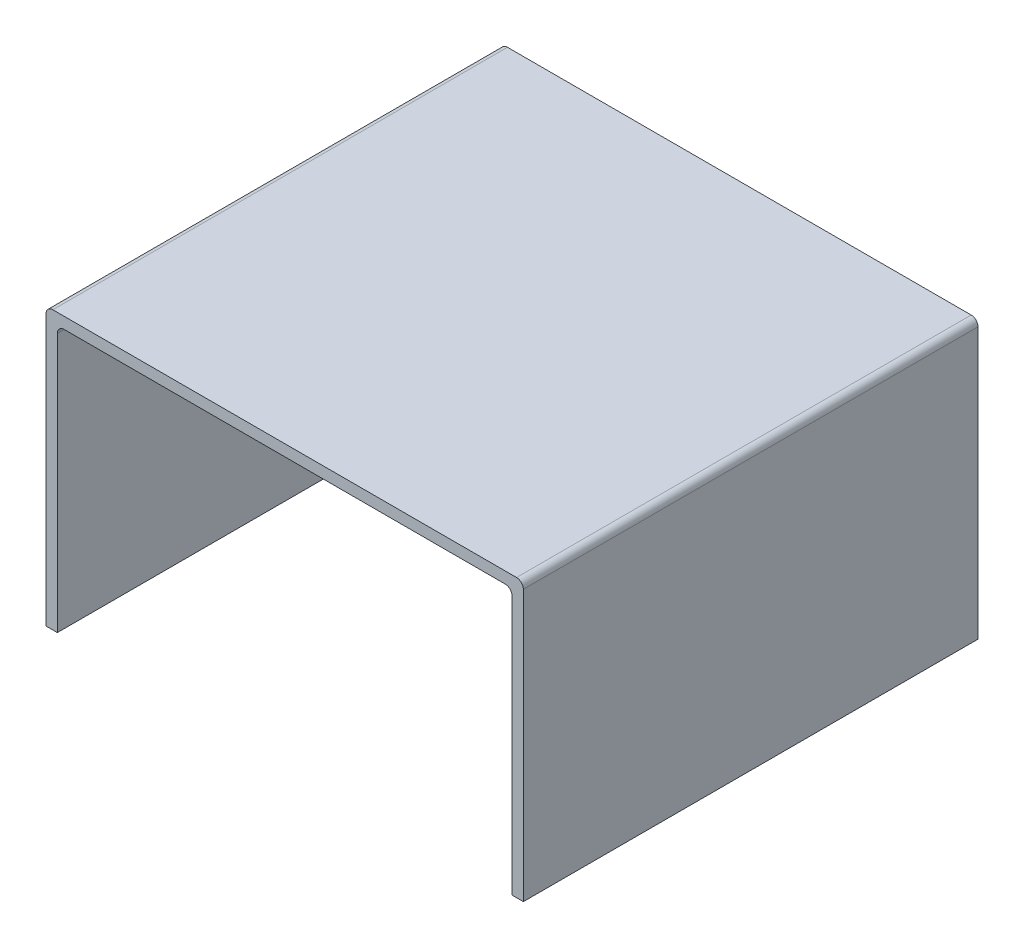
ISO-10303-21;
HEADER;
FILE_DESCRIPTION(('STEP AP214'),'2;1');
FILE_NAME('part.step','',(''),(''),'','','');
FILE_SCHEMA(('AUTOMOTIVE_DESIGN { 1 0 10303 214 1 1 1 1 }'));
ENDSEC;
DATA;
#1=APPLICATION_CONTEXT('core data for automotive mechanical design processes');
#2=APPLICATION_PROTOCOL_DEFINITION('international standard','automotive_design',2000,#1);
#3=PRODUCT_CONTEXT('',#1,'mechanical');
#4=PRODUCT('Part','Part','',(#3));
#5=PRODUCT_RELATED_PRODUCT_CATEGORY('part','',(#4));
#6=PRODUCT_DEFINITION_FORMATION('','',#4);
#7=PRODUCT_DEFINITION_CONTEXT('part definition',#1,'design');
#8=PRODUCT_DEFINITION('design','',#6,#7);
#9=PRODUCT_DEFINITION_SHAPE('','',#8);
#10=(LENGTH_UNIT() NAMED_UNIT(*) SI_UNIT(.MILLI.,.METRE.));
#11=(NAMED_UNIT(*) PLANE_ANGLE_UNIT() SI_UNIT($,.RADIAN.));
#12=(NAMED_UNIT(*) SI_UNIT($,.STERADIAN.) SOLID_ANGLE_UNIT());
#13=UNCERTAINTY_MEASURE_WITH_UNIT(LENGTH_MEASURE(1.E-05),#10,'distance_accuracy_value','');
#14=(GEOMETRIC_REPRESENTATION_CONTEXT(3) GLOBAL_UNCERTAINTY_ASSIGNED_CONTEXT((#13)) GLOBAL_UNIT_ASSIGNED_CONTEXT((#10,
#11,#12)) REPRESENTATION_CONTEXT('',''));
#15=CARTESIAN_POINT('',(0.,0.,0.));
#16=DIRECTION('',(0.,0.,1.));
#17=DIRECTION('',(1.,0.,0.));
#18=AXIS2_PLACEMENT_3D('',#15,#16,#17);
#19=CARTESIAN_POINT('',(5.,0.,200.));
#20=DIRECTION('',(0.,1.,0.));
#21=DIRECTION('',(0.,0.,1.));
#22=AXIS2_PLACEMENT_3D('',#19,#20,#21);
#23=PLANE('',#22);
#24=DIRECTION('',(1.,0.,0.));
#25=VECTOR('',#24,1.);
#26=CARTESIAN_POINT('',(5.,0.,0.));
#27=LINE('',#26,#25);
#28=CARTESIAN_POINT('',(0.,0.,0.));
#29=VERTEX_POINT('',#28);
#30=CARTESIAN_POINT('',(5.,0.,0.));
#31=VERTEX_POINT('',#30);
#32=EDGE_CURVE('E153',#29,#31,#27,.T.);
#33=ORIENTED_EDGE('',*,*,#32,.T.);
#34=DIRECTION('',(0.,0.,-1.));
#35=VECTOR('',#34,1.);
#36=CARTESIAN_POINT('',(5.,0.,200.));
#37=LINE('',#36,#35);
#38=CARTESIAN_POINT('',(5.,0.,200.));
#39=VERTEX_POINT('',#38);
#40=EDGE_CURVE('E11',#39,#31,#37,.T.);
#41=ORIENTED_EDGE('',*,*,#40,.F.);
#42=DIRECTION('',(1.,0.,0.));
#43=VECTOR('',#42,1.);
#44=CARTESIAN_POINT('',(5.,0.,200.));
#45=LINE('',#44,#43);
#46=CARTESIAN_POINT('',(0.,0.,200.));
#47=VERTEX_POINT('',#46);
#48=EDGE_CURVE('E175',#47,#39,#45,.T.);
#49=ORIENTED_EDGE('',*,*,#48,.F.);
#50=DIRECTION('',(0.,0.,-1.));
#51=VECTOR('',#50,1.);
#52=CARTESIAN_POINT('',(0.,0.,200.));
#53=LINE('',#52,#51);
#54=EDGE_CURVE('E149',#47,#29,#53,.T.);
#55=ORIENTED_EDGE('',*,*,#54,.T.);
#56=EDGE_LOOP('',(#33,#41,#49,#55));
#57=FACE_BOUND('',#56,.T.);
#58=ADVANCED_FACE('F33',(#57),#23,.F.);
#59=CARTESIAN_POINT('',(4.99999999999999,114.,200.));
#60=DIRECTION('',(-1.,0.,0.));
#61=DIRECTION('',(0.,-1.,0.));
#62=AXIS2_PLACEMENT_3D('',#59,#60,#61);
#63=PLANE('',#62);
#64=DIRECTION('',(0.,1.,0.));
#65=VECTOR('',#64,1.);
#66=CARTESIAN_POINT('',(4.99999999999999,114.,0.));
#67=LINE('',#66,#65);
#68=CARTESIAN_POINT('',(4.99999999999999,114.,0.));
#69=VERTEX_POINT('',#68);
#70=EDGE_CURVE('E156',#31,#69,#67,.T.);
#71=ORIENTED_EDGE('',*,*,#70,.T.);
#72=DIRECTION('',(0.,0.,-1.));
#73=VECTOR('',#72,1.);
#74=CARTESIAN_POINT('',(4.99999999999999,114.,200.));
#75=LINE('',#74,#73);
#76=CARTESIAN_POINT('',(4.99999999999999,114.,200.));
#77=VERTEX_POINT('',#76);
#78=EDGE_CURVE('E41',#77,#69,#75,.T.);
#79=ORIENTED_EDGE('',*,*,#78,.F.);
#80=DIRECTION('',(0.,1.,0.));
#81=VECTOR('',#80,1.);
#82=CARTESIAN_POINT('',(4.99999999999999,114.,200.));
#83=LINE('',#82,#81);
#84=EDGE_CURVE('E104',#39,#77,#83,.T.);
#85=ORIENTED_EDGE('',*,*,#84,.F.);
#86=ORIENTED_EDGE('',*,*,#40,.T.);
#87=EDGE_LOOP('',(#71,#79,#85,#86));
#88=FACE_BOUND('',#87,.T.);
#89=ADVANCED_FACE('F253',(#88),#63,.F.);
#90=CARTESIAN_POINT('',(7.99999999999999,114.,200.));
#91=DIRECTION('',(0.,0.,-1.));
#92=DIRECTION('',(-1.,0.,0.));
#93=AXIS2_PLACEMENT_3D('',#90,#91,#92);
#94=CYLINDRICAL_SURFACE('',#93,3.);
#95=CARTESIAN_POINT('',(7.99999999999999,114.,0.));
#96=DIRECTION('',(0.,0.,-1.));
#97=DIRECTION('',(1.,0.,0.));
#98=AXIS2_PLACEMENT_3D('',#95,#96,#97);
#99=CIRCLE('',#98,3.);
#100=CARTESIAN_POINT('',(8.00000000000001,117.,0.));
#101=VERTEX_POINT('',#100);
#102=EDGE_CURVE('E158',#69,#101,#99,.T.);
#103=ORIENTED_EDGE('',*,*,#102,.T.);
#104=DIRECTION('',(0.,0.,-1.));
#105=VECTOR('',#104,1.);
#106=CARTESIAN_POINT('',(8.00000000000001,117.,200.));
#107=LINE('',#106,#105);
#108=CARTESIAN_POINT('',(8.00000000000001,117.,200.));
#109=VERTEX_POINT('',#108);
#110=EDGE_CURVE('E194',#109,#101,#107,.T.);
#111=ORIENTED_EDGE('',*,*,#110,.F.);
#112=CARTESIAN_POINT('',(7.99999999999999,114.,200.));
#113=DIRECTION('',(0.,0.,-1.));
#114=DIRECTION('',(1.,0.,0.));
#115=AXIS2_PLACEMENT_3D('',#112,#113,#114);
#116=CIRCLE('',#115,3.);
#117=EDGE_CURVE('E202',#77,#109,#116,.T.);
#118=ORIENTED_EDGE('',*,*,#117,.F.);
#119=ORIENTED_EDGE('',*,*,#78,.T.);
#120=EDGE_LOOP('',(#103,#111,#118,#119));
#121=FACE_BOUND('',#120,.T.);
#122=ADVANCED_FACE('F200',(#121),#94,.F.);
#123=CARTESIAN_POINT('',(202.,117.,200.));
#124=DIRECTION('',(0.,1.,0.));
#125=DIRECTION('',(-1.,0.,0.));
#126=AXIS2_PLACEMENT_3D('',#123,#124,#125);
#127=PLANE('',#126);
#128=DIRECTION('',(1.,0.,0.));
#129=VECTOR('',#128,1.);
#130=CARTESIAN_POINT('',(202.,117.,0.));
#131=LINE('',#130,#129);
#132=CARTESIAN_POINT('',(202.,117.,0.));
#133=VERTEX_POINT('',#132);
#134=EDGE_CURVE('E160',#101,#133,#131,.T.);
#135=ORIENTED_EDGE('',*,*,#134,.T.);
#136=DIRECTION('',(0.,0.,-1.));
#137=VECTOR('',#136,1.);
#138=CARTESIAN_POINT('',(202.,117.,200.));
#139=LINE('',#138,#137);
#140=CARTESIAN_POINT('',(202.,117.,200.));
#141=VERTEX_POINT('',#140);
#142=EDGE_CURVE('E191',#141,#133,#139,.T.);
#143=ORIENTED_EDGE('',*,*,#142,.F.);
#144=DIRECTION('',(1.,0.,0.));
#145=VECTOR('',#144,1.);
#146=CARTESIAN_POINT('',(202.,117.,200.));
#147=LINE('',#146,#145);
#148=EDGE_CURVE('E220',#109,#141,#147,.T.);
#149=ORIENTED_EDGE('',*,*,#148,.F.);
#150=ORIENTED_EDGE('',*,*,#110,.T.);
#151=EDGE_LOOP('',(#135,#143,#149,#150));
#152=FACE_BOUND('',#151,.T.);
#153=ADVANCED_FACE('F211',(#152),#127,.F.);
#154=CARTESIAN_POINT('',(202.,114.,200.));
#155=DIRECTION('',(0.,0.,-1.));
#156=DIRECTION('',(-1.,0.,0.));
#157=AXIS2_PLACEMENT_3D('',#154,#155,#156);
#158=CYLINDRICAL_SURFACE('',#157,3.);
#159=CARTESIAN_POINT('',(202.,114.,0.));
#160=DIRECTION('',(0.,0.,-1.));
#161=DIRECTION('',(1.,0.,0.));
#162=AXIS2_PLACEMENT_3D('',#159,#160,#161);
#163=CIRCLE('',#162,3.);
#164=CARTESIAN_POINT('',(205.,114.,0.));
#165=VERTEX_POINT('',#164);
#166=EDGE_CURVE('E162',#133,#165,#163,.T.);
#167=ORIENTED_EDGE('',*,*,#166,.T.);
#168=DIRECTION('',(0.,0.,-1.));
#169=VECTOR('',#168,1.);
#170=CARTESIAN_POINT('',(205.,114.,200.));
#171=LINE('',#170,#169);
#172=CARTESIAN_POINT('',(205.,114.,200.));
#173=VERTEX_POINT('',#172);
#174=EDGE_CURVE('E188',#173,#165,#171,.T.);
#175=ORIENTED_EDGE('',*,*,#174,.F.);
#176=CARTESIAN_POINT('',(202.,114.,200.));
#177=DIRECTION('',(0.,0.,-1.));
#178=DIRECTION('',(1.,0.,0.));
#179=AXIS2_PLACEMENT_3D('',#176,#177,#178);
#180=CIRCLE('',#179,3.);
#181=EDGE_CURVE('E217',#141,#173,#180,.T.);
#182=ORIENTED_EDGE('',*,*,#181,.F.);
#183=ORIENTED_EDGE('',*,*,#142,.T.);
#184=EDGE_LOOP('',(#167,#175,#182,#183));
#185=FACE_BOUND('',#184,.T.);
#186=ADVANCED_FACE('F215',(#185),#158,.F.);
#187=CARTESIAN_POINT('',(205.,0.,200.));
#188=DIRECTION('',(1.,0.,0.));
#189=DIRECTION('',(0.,0.,-1.));
#190=AXIS2_PLACEMENT_3D('',#187,#188,#189);
#191=PLANE('',#190);
#192=DIRECTION('',(0.,-1.,0.));
#193=VECTOR('',#192,1.);
#194=CARTESIAN_POINT('',(205.,0.,0.));
#195=LINE('',#194,#193);
#196=CARTESIAN_POINT('',(205.,0.,0.));
#197=VERTEX_POINT('',#196);
#198=EDGE_CURVE('E164',#165,#197,#195,.T.);
#199=ORIENTED_EDGE('',*,*,#198,.T.);
#200=DIRECTION('',(0.,0.,-1.));
#201=VECTOR('',#200,1.);
#202=CARTESIAN_POINT('',(205.,0.,200.));
#203=LINE('',#202,#201);
#204=CARTESIAN_POINT('',(205.,0.,200.));
#205=VERTEX_POINT('',#204);
#206=EDGE_CURVE('E185',#205,#197,#203,.T.);
#207=ORIENTED_EDGE('',*,*,#206,.F.);
#208=DIRECTION('',(0.,-1.,0.));
#209=VECTOR('',#208,1.);
#210=CARTESIAN_POINT('',(205.,0.,200.));
#211=LINE('',#210,#209);
#212=EDGE_CURVE('E219',#173,#205,#211,.T.);
#213=ORIENTED_EDGE('',*,*,#212,.F.);
#214=ORIENTED_EDGE('',*,*,#174,.T.);
#215=EDGE_LOOP('',(#199,#207,#213,#214));
#216=FACE_BOUND('',#215,.T.);
#217=ADVANCED_FACE('F266',(#216),#191,.F.);
#218=CARTESIAN_POINT('',(210.,0.,200.));
#219=DIRECTION('',(0.,1.,0.));
#220=DIRECTION('',(-1.,0.,0.));
#221=AXIS2_PLACEMENT_3D('',#218,#219,#220);
#222=PLANE('',#221);
#223=DIRECTION('',(1.,0.,0.));
#224=VECTOR('',#223,1.);
#225=CARTESIAN_POINT('',(210.,0.,0.));
#226=LINE('',#225,#224);
#227=CARTESIAN_POINT('',(210.,0.,0.));
#228=VERTEX_POINT('',#227);
#229=EDGE_CURVE('E166',#197,#228,#226,.T.);
#230=ORIENTED_EDGE('',*,*,#229,.T.);
#231=DIRECTION('',(0.,0.,-1.));
#232=VECTOR('',#231,1.);
#233=CARTESIAN_POINT('',(210.,0.,200.));
#234=LINE('',#233,#232);
#235=CARTESIAN_POINT('',(210.,0.,200.));
#236=VERTEX_POINT('',#235);
#237=EDGE_CURVE('E182',#236,#228,#234,.T.);
#238=ORIENTED_EDGE('',*,*,#237,.F.);
#239=DIRECTION('',(1.,0.,0.));
#240=VECTOR('',#239,1.);
#241=CARTESIAN_POINT('',(210.,0.,200.));
#242=LINE('',#241,#240);
#243=EDGE_CURVE('E222',#205,#236,#242,.T.);
#244=ORIENTED_EDGE('',*,*,#243,.F.);
#245=ORIENTED_EDGE('',*,*,#206,.T.);
#246=EDGE_LOOP('',(#230,#238,#244,#245));
#247=FACE_BOUND('',#246,.T.);
#248=ADVANCED_FACE('F269',(#247),#222,.F.);
#249=CARTESIAN_POINT('',(210.,119.,200.));
#250=DIRECTION('',(-1.,0.,0.));
#251=DIRECTION('',(0.,-1.,0.));
#252=AXIS2_PLACEMENT_3D('',#249,#250,#251);
#253=PLANE('',#252);
#254=DIRECTION('',(0.,1.,0.));
#255=VECTOR('',#254,1.);
#256=CARTESIAN_POINT('',(210.,119.,0.));
#257=LINE('',#256,#255);
#258=CARTESIAN_POINT('',(210.,119.,0.));
#259=VERTEX_POINT('',#258);
#260=EDGE_CURVE('E168',#228,#259,#257,.T.);
#261=ORIENTED_EDGE('',*,*,#260,.T.);
#262=DIRECTION('',(0.,0.,-1.));
#263=VECTOR('',#262,1.);
#264=CARTESIAN_POINT('',(210.,119.,200.));
#265=LINE('',#264,#263);
#266=CARTESIAN_POINT('',(210.,119.,200.));
#267=VERTEX_POINT('',#266);
#268=EDGE_CURVE('E179',#267,#259,#265,.T.);
#269=ORIENTED_EDGE('',*,*,#268,.F.);
#270=DIRECTION('',(0.,1.,0.));
#271=VECTOR('',#270,1.);
#272=CARTESIAN_POINT('',(210.,119.,200.));
#273=LINE('',#272,#271);
#274=EDGE_CURVE('E228',#236,#267,#273,.T.);
#275=ORIENTED_EDGE('',*,*,#274,.F.);
#276=ORIENTED_EDGE('',*,*,#237,.T.);
#277=EDGE_LOOP('',(#261,#269,#275,#276));
#278=FACE_BOUND('',#277,.T.);
#279=ADVANCED_FACE('F234',(#278),#253,.F.);
#280=CARTESIAN_POINT('',(207.,119.,200.));
#281=DIRECTION('',(0.,0.,-1.));
#282=DIRECTION('',(-1.,0.,0.));
#283=AXIS2_PLACEMENT_3D('',#280,#281,#282);
#284=CYLINDRICAL_SURFACE('',#283,3.);
#285=CARTESIAN_POINT('',(207.,119.,0.));
#286=DIRECTION('',(0.,0.,1.));
#287=DIRECTION('',(-1.,0.,0.));
#288=AXIS2_PLACEMENT_3D('',#285,#286,#287);
#289=CIRCLE('',#288,3.);
#290=CARTESIAN_POINT('',(207.,122.,0.));
#291=VERTEX_POINT('',#290);
#292=EDGE_CURVE('E170',#259,#291,#289,.T.);
#293=ORIENTED_EDGE('',*,*,#292,.T.);
#294=DIRECTION('',(0.,0.,-1.));
#295=VECTOR('',#294,1.);
#296=CARTESIAN_POINT('',(207.,122.,200.));
#297=LINE('',#296,#295);
#298=CARTESIAN_POINT('',(207.,122.,200.));
#299=VERTEX_POINT('',#298);
#300=EDGE_CURVE('E144',#299,#291,#297,.T.);
#301=ORIENTED_EDGE('',*,*,#300,.F.);
#302=CARTESIAN_POINT('',(207.,119.,200.));
#303=DIRECTION('',(0.,0.,1.));
#304=DIRECTION('',(-1.,0.,0.));
#305=AXIS2_PLACEMENT_3D('',#302,#303,#304);
#306=CIRCLE('',#305,3.);
#307=EDGE_CURVE('E135',#267,#299,#306,.T.);
#308=ORIENTED_EDGE('',*,*,#307,.F.);
#309=ORIENTED_EDGE('',*,*,#268,.T.);
#310=EDGE_LOOP('',(#293,#301,#308,#309));
#311=FACE_BOUND('',#310,.T.);
#312=ADVANCED_FACE('F238',(#311),#284,.T.);
#313=CARTESIAN_POINT('',(3.00000000000002,122.,200.));
#314=DIRECTION('',(0.,-1.,0.));
#315=DIRECTION('',(1.,0.,0.));
#316=AXIS2_PLACEMENT_3D('',#313,#314,#315);
#317=PLANE('',#316);
#318=DIRECTION('',(-1.,0.,0.));
#319=VECTOR('',#318,1.);
#320=CARTESIAN_POINT('',(3.00000000000002,122.,0.));
#321=LINE('',#320,#319);
#322=CARTESIAN_POINT('',(3.00000000000002,122.,0.));
#323=VERTEX_POINT('',#322);
#324=EDGE_CURVE('E143',#291,#323,#321,.T.);
#325=ORIENTED_EDGE('',*,*,#324,.T.);
#326=DIRECTION('',(0.,0.,-1.));
#327=VECTOR('',#326,1.);
#328=CARTESIAN_POINT('',(3.00000000000002,122.,200.));
#329=LINE('',#328,#327);
#330=CARTESIAN_POINT('',(3.00000000000002,122.,200.));
#331=VERTEX_POINT('',#330);
#332=EDGE_CURVE('E140',#331,#323,#329,.T.);
#333=ORIENTED_EDGE('',*,*,#332,.F.);
#334=DIRECTION('',(-1.,0.,0.));
#335=VECTOR('',#334,1.);
#336=CARTESIAN_POINT('',(3.00000000000002,122.,200.));
#337=LINE('',#336,#335);
#338=EDGE_CURVE('E129',#299,#331,#337,.T.);
#339=ORIENTED_EDGE('',*,*,#338,.F.);
#340=ORIENTED_EDGE('',*,*,#300,.T.);
#341=EDGE_LOOP('',(#325,#333,#339,#340));
#342=FACE_BOUND('',#341,.T.);
#343=ADVANCED_FACE('F141',(#342),#317,.F.);
#344=CARTESIAN_POINT('',(3.,119.,200.));
#345=DIRECTION('',(0.,0.,-1.));
#346=DIRECTION('',(-1.,0.,0.));
#347=AXIS2_PLACEMENT_3D('',#344,#345,#346);
#348=CYLINDRICAL_SURFACE('',#347,3.);
#349=CARTESIAN_POINT('',(3.,119.,0.));
#350=DIRECTION('',(0.,0.,1.));
#351=DIRECTION('',(-1.,0.,0.));
#352=AXIS2_PLACEMENT_3D('',#349,#350,#351);
#353=CIRCLE('',#352,3.);
#354=CARTESIAN_POINT('',(0.,119.,0.));
#355=VERTEX_POINT('',#354);
#356=EDGE_CURVE('E90',#323,#355,#353,.T.);
#357=ORIENTED_EDGE('',*,*,#356,.T.);
#358=DIRECTION('',(0.,0.,-1.));
#359=VECTOR('',#358,1.);
#360=CARTESIAN_POINT('',(0.,119.,200.));
#361=LINE('',#360,#359);
#362=CARTESIAN_POINT('',(0.,119.,200.));
#363=VERTEX_POINT('',#362);
#364=EDGE_CURVE('E145',#363,#355,#361,.T.);
#365=ORIENTED_EDGE('',*,*,#364,.F.);
#366=CARTESIAN_POINT('',(3.,119.,200.));
#367=DIRECTION('',(0.,0.,1.));
#368=DIRECTION('',(-1.,0.,0.));
#369=AXIS2_PLACEMENT_3D('',#366,#367,#368);
#370=CIRCLE('',#369,3.);
#371=EDGE_CURVE('E133',#331,#363,#370,.T.);
#372=ORIENTED_EDGE('',*,*,#371,.F.);
#373=ORIENTED_EDGE('',*,*,#332,.T.);
#374=EDGE_LOOP('',(#357,#365,#372,#373));
#375=FACE_BOUND('',#374,.T.);
#376=ADVANCED_FACE('F147',(#375),#348,.T.);
#377=CARTESIAN_POINT('',(0.,0.,200.));
#378=DIRECTION('',(1.,0.,0.));
#379=DIRECTION('',(0.,0.,-1.));
#380=AXIS2_PLACEMENT_3D('',#377,#378,#379);
#381=PLANE('',#380);
#382=DIRECTION('',(0.,-1.,0.));
#383=VECTOR('',#382,1.);
#384=CARTESIAN_POINT('',(0.,0.,0.));
#385=LINE('',#384,#383);
#386=EDGE_CURVE('E96',#355,#29,#385,.T.);
#387=ORIENTED_EDGE('',*,*,#386,.T.);
#388=ORIENTED_EDGE('',*,*,#54,.F.);
#389=DIRECTION('',(0.,-1.,0.));
#390=VECTOR('',#389,1.);
#391=CARTESIAN_POINT('',(0.,0.,200.));
#392=LINE('',#391,#390);
#393=EDGE_CURVE('E49',#363,#47,#392,.T.);
#394=ORIENTED_EDGE('',*,*,#393,.F.);
#395=ORIENTED_EDGE('',*,*,#364,.T.);
#396=EDGE_LOOP('',(#387,#388,#394,#395));
#397=FACE_BOUND('',#396,.T.);
#398=ADVANCED_FACE('F242',(#397),#381,.F.);
#399=CARTESIAN_POINT('',(3.,119.,200.));
#400=DIRECTION('',(0.,0.,-1.));
#401=DIRECTION('',(-1.,0.,0.));
#402=AXIS2_PLACEMENT_3D('',#399,#400,#401);
#403=PLANE('',#402);
#404=ORIENTED_EDGE('',*,*,#48,.T.);
#405=ORIENTED_EDGE('',*,*,#84,.T.);
#406=ORIENTED_EDGE('',*,*,#117,.T.);
#407=ORIENTED_EDGE('',*,*,#148,.T.);
#408=ORIENTED_EDGE('',*,*,#181,.T.);
#409=ORIENTED_EDGE('',*,*,#212,.T.);
#410=ORIENTED_EDGE('',*,*,#243,.T.);
#411=ORIENTED_EDGE('',*,*,#274,.T.);
#412=ORIENTED_EDGE('',*,*,#307,.T.);
#413=ORIENTED_EDGE('',*,*,#338,.T.);
#414=ORIENTED_EDGE('',*,*,#371,.T.);
#415=ORIENTED_EDGE('',*,*,#393,.T.);
#416=EDGE_LOOP('',(#404,#405,#406,#407,#408,#409,#410,#411,#412,#413,#414,#415));
#417=FACE_BOUND('',#416,.T.);
#418=ADVANCED_FACE('F131',(#417),#403,.F.);
#419=CARTESIAN_POINT('',(3.,119.,0.));
#420=DIRECTION('',(0.,0.,-1.));
#421=DIRECTION('',(-1.,0.,0.));
#422=AXIS2_PLACEMENT_3D('',#419,#420,#421);
#423=PLANE('',#422);
#424=ORIENTED_EDGE('',*,*,#32,.F.);
#425=ORIENTED_EDGE('',*,*,#386,.F.);
#426=ORIENTED_EDGE('',*,*,#356,.F.);
#427=ORIENTED_EDGE('',*,*,#324,.F.);
#428=ORIENTED_EDGE('',*,*,#292,.F.);
#429=ORIENTED_EDGE('',*,*,#260,.F.);
#430=ORIENTED_EDGE('',*,*,#229,.F.);
#431=ORIENTED_EDGE('',*,*,#198,.F.);
#432=ORIENTED_EDGE('',*,*,#166,.F.);
#433=ORIENTED_EDGE('',*,*,#134,.F.);
#434=ORIENTED_EDGE('',*,*,#102,.F.);
#435=ORIENTED_EDGE('',*,*,#70,.F.);
#436=EDGE_LOOP('',(#424,#425,#426,#427,#428,#429,#430,#431,#432,#433,#434,#435));
#437=FACE_BOUND('',#436,.T.);
#438=ADVANCED_FACE('F206',(#437),#423,.T.);
#439=CLOSED_SHELL('',(#58,#89,#122,#153,#186,#217,#248,#279,#312,#343,#376,#398,#418,#438));
#440=MANIFOLD_SOLID_BREP('B2',#439);
#441=ADVANCED_BREP_SHAPE_REPRESENTATION('',(#18,#440),#14);
#442=SHAPE_DEFINITION_REPRESENTATION(#9,#441);
ENDSEC;
END-ISO-10303-21;
